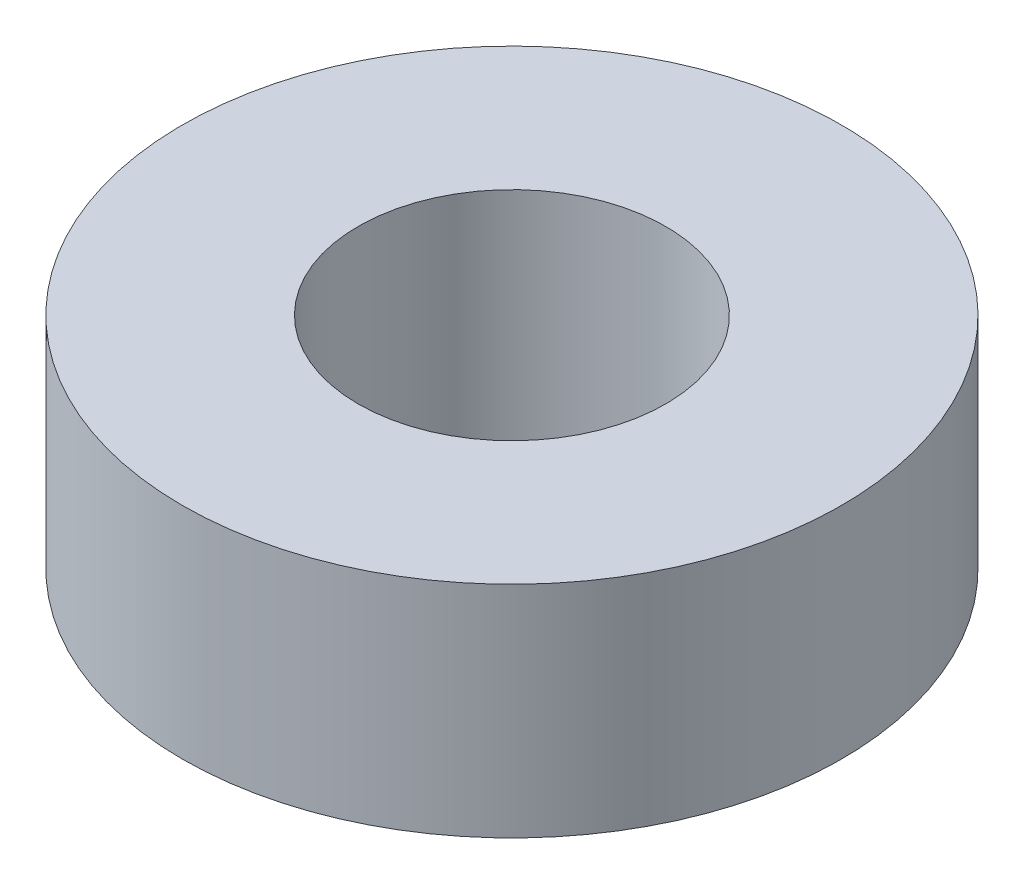
ISO-10303-21;
HEADER;
FILE_DESCRIPTION(('STEP AP214'),'2;1');
FILE_NAME('part.step','',(''),(''),'','','');
FILE_SCHEMA(('AUTOMOTIVE_DESIGN { 1 0 10303 214 1 1 1 1 }'));
ENDSEC;
DATA;
#1=APPLICATION_CONTEXT('core data for automotive mechanical design processes');
#2=APPLICATION_PROTOCOL_DEFINITION('international standard','automotive_design',2000,#1);
#3=PRODUCT_CONTEXT('',#1,'mechanical');
#4=PRODUCT('Part','Part','',(#3));
#5=PRODUCT_RELATED_PRODUCT_CATEGORY('part','',(#4));
#6=PRODUCT_DEFINITION_FORMATION('','',#4);
#7=PRODUCT_DEFINITION_CONTEXT('part definition',#1,'design');
#8=PRODUCT_DEFINITION('design','',#6,#7);
#9=PRODUCT_DEFINITION_SHAPE('','',#8);
#10=(LENGTH_UNIT() NAMED_UNIT(*) SI_UNIT(.MILLI.,.METRE.));
#11=(NAMED_UNIT(*) PLANE_ANGLE_UNIT() SI_UNIT($,.RADIAN.));
#12=(NAMED_UNIT(*) SI_UNIT($,.STERADIAN.) SOLID_ANGLE_UNIT());
#13=UNCERTAINTY_MEASURE_WITH_UNIT(LENGTH_MEASURE(1.E-05),#10,'distance_accuracy_value','');
#14=(GEOMETRIC_REPRESENTATION_CONTEXT(3) GLOBAL_UNCERTAINTY_ASSIGNED_CONTEXT((#13)) GLOBAL_UNIT_ASSIGNED_CONTEXT((#10,
#11,#12)) REPRESENTATION_CONTEXT('',''));
#15=CARTESIAN_POINT('',(0.,0.,0.));
#16=DIRECTION('',(0.,0.,1.));
#17=DIRECTION('',(1.,0.,0.));
#18=AXIS2_PLACEMENT_3D('',#15,#16,#17);
#19=CARTESIAN_POINT('',(0.,10.,0.));
#20=DIRECTION('',(0.,1.,0.));
#21=DIRECTION('',(0.,0.,1.));
#22=AXIS2_PLACEMENT_3D('',#19,#20,#21);
#23=PLANE('',#22);
#24=CARTESIAN_POINT('',(0.,10.,0.));
#25=DIRECTION('',(0.,1.,0.));
#26=DIRECTION('',(0.,0.,1.));
#27=AXIS2_PLACEMENT_3D('',#24,#25,#26);
#28=CIRCLE('',#27,15.);
#29=CARTESIAN_POINT('',(0.,10.,15.));
#30=VERTEX_POINT('',#29);
#31=EDGE_CURVE('E10',#30,#30,#28,.T.);
#32=ORIENTED_EDGE('',*,*,#31,.T.);
#33=EDGE_LOOP('',(#32));
#34=FACE_BOUND('',#33,.T.);
#35=CARTESIAN_POINT('',(0.,10.,0.));
#36=DIRECTION('',(0.,1.,0.));
#37=DIRECTION('',(0.,0.,1.));
#38=AXIS2_PLACEMENT_3D('',#35,#36,#37);
#39=CIRCLE('',#38,7.);
#40=CARTESIAN_POINT('',(0.,10.,7.));
#41=VERTEX_POINT('',#40);
#42=EDGE_CURVE('E50',#41,#41,#39,.T.);
#43=ORIENTED_EDGE('',*,*,#42,.F.);
#44=EDGE_LOOP('',(#43));
#45=FACE_BOUND('',#44,.T.);
#46=ADVANCED_FACE('F37',(#34,#45),#23,.T.);
#47=CARTESIAN_POINT('',(0.,0.,0.));
#48=DIRECTION('',(0.,1.,0.));
#49=DIRECTION('',(0.,0.,1.));
#50=AXIS2_PLACEMENT_3D('',#47,#48,#49);
#51=PLANE('',#50);
#52=CARTESIAN_POINT('',(0.,0.,0.));
#53=DIRECTION('',(0.,1.,0.));
#54=DIRECTION('',(0.,0.,1.));
#55=AXIS2_PLACEMENT_3D('',#52,#53,#54);
#56=CIRCLE('',#55,15.);
#57=CARTESIAN_POINT('',(0.,0.,15.));
#58=VERTEX_POINT('',#57);
#59=EDGE_CURVE('E41',#58,#58,#56,.T.);
#60=ORIENTED_EDGE('',*,*,#59,.F.);
#61=EDGE_LOOP('',(#60));
#62=FACE_BOUND('',#61,.T.);
#63=CARTESIAN_POINT('',(0.,0.,0.));
#64=DIRECTION('',(0.,1.,0.));
#65=DIRECTION('',(0.,0.,1.));
#66=AXIS2_PLACEMENT_3D('',#63,#64,#65);
#67=CIRCLE('',#66,7.);
#68=CARTESIAN_POINT('',(0.,0.,7.));
#69=VERTEX_POINT('',#68);
#70=EDGE_CURVE('E52',#69,#69,#67,.T.);
#71=ORIENTED_EDGE('',*,*,#70,.T.);
#72=EDGE_LOOP('',(#71));
#73=FACE_BOUND('',#72,.T.);
#74=ADVANCED_FACE('F64',(#62,#73),#51,.F.);
#75=CARTESIAN_POINT('',(0.,10.,0.));
#76=DIRECTION('',(0.,-1.,0.));
#77=DIRECTION('',(0.,0.,-1.));
#78=AXIS2_PLACEMENT_3D('',#75,#76,#77);
#79=CYLINDRICAL_SURFACE('',#78,15.);
#80=ORIENTED_EDGE('',*,*,#31,.F.);
#81=EDGE_LOOP('',(#80));
#82=FACE_BOUND('',#81,.T.);
#83=ORIENTED_EDGE('',*,*,#59,.T.);
#84=EDGE_LOOP('',(#83));
#85=FACE_BOUND('',#84,.T.);
#86=ADVANCED_FACE('F39',(#82,#85),#79,.T.);
#87=CARTESIAN_POINT('',(0.,10.,0.));
#88=DIRECTION('',(0.,-1.,0.));
#89=DIRECTION('',(0.,0.,-1.));
#90=AXIS2_PLACEMENT_3D('',#87,#88,#89);
#91=CYLINDRICAL_SURFACE('',#90,7.);
#92=ORIENTED_EDGE('',*,*,#42,.T.);
#93=EDGE_LOOP('',(#92));
#94=FACE_BOUND('',#93,.T.);
#95=ORIENTED_EDGE('',*,*,#70,.F.);
#96=EDGE_LOOP('',(#95));
#97=FACE_BOUND('',#96,.T.);
#98=ADVANCED_FACE('F60',(#94,#97),#91,.F.);
#99=CLOSED_SHELL('',(#46,#74,#86,#98));
#100=MANIFOLD_SOLID_BREP('B2',#99);
#101=ADVANCED_BREP_SHAPE_REPRESENTATION('',(#18,#100),#14);
#102=SHAPE_DEFINITION_REPRESENTATION(#9,#101);
ENDSEC;
END-ISO-10303-21;
